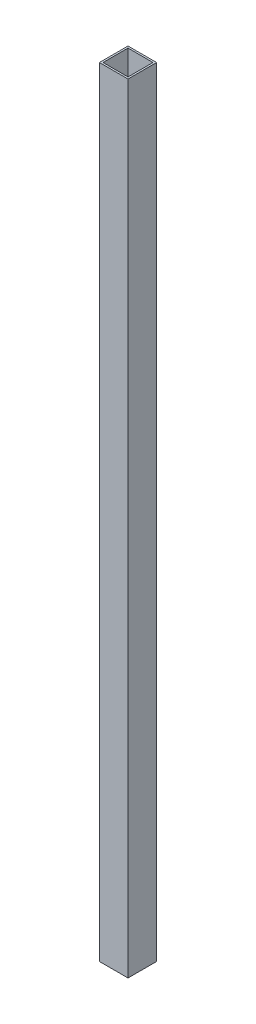
ISO-10303-21;
HEADER;
FILE_DESCRIPTION(('STEP AP214'),'2;1');
FILE_NAME('part.step','',(''),(''),'','','');
FILE_SCHEMA(('AUTOMOTIVE_DESIGN { 1 0 10303 214 1 1 1 1 }'));
ENDSEC;
DATA;
#1=APPLICATION_CONTEXT('core data for automotive mechanical design processes');
#2=APPLICATION_PROTOCOL_DEFINITION('international standard','automotive_design',2000,#1);
#3=PRODUCT_CONTEXT('',#1,'mechanical');
#4=PRODUCT('Part','Part','',(#3));
#5=PRODUCT_RELATED_PRODUCT_CATEGORY('part','',(#4));
#6=PRODUCT_DEFINITION_FORMATION('','',#4);
#7=PRODUCT_DEFINITION_CONTEXT('part definition',#1,'design');
#8=PRODUCT_DEFINITION('design','',#6,#7);
#9=PRODUCT_DEFINITION_SHAPE('','',#8);
#10=(LENGTH_UNIT() NAMED_UNIT(*) SI_UNIT(.MILLI.,.METRE.));
#11=(NAMED_UNIT(*) PLANE_ANGLE_UNIT() SI_UNIT($,.RADIAN.));
#12=(NAMED_UNIT(*) SI_UNIT($,.STERADIAN.) SOLID_ANGLE_UNIT());
#13=UNCERTAINTY_MEASURE_WITH_UNIT(LENGTH_MEASURE(1.E-05),#10,'distance_accuracy_value','');
#14=(GEOMETRIC_REPRESENTATION_CONTEXT(3) GLOBAL_UNCERTAINTY_ASSIGNED_CONTEXT((#13)) GLOBAL_UNIT_ASSIGNED_CONTEXT((#10,
#11,#12)) REPRESENTATION_CONTEXT('',''));
#15=CARTESIAN_POINT('',(0.,0.,0.));
#16=DIRECTION('',(0.,0.,1.));
#17=DIRECTION('',(1.,0.,0.));
#18=AXIS2_PLACEMENT_3D('',#15,#16,#17);
#19=CARTESIAN_POINT('',(88.9,0.,25.4));
#20=DIRECTION('',(-1.,0.,0.));
#21=DIRECTION('',(0.,0.,1.));
#22=AXIS2_PLACEMENT_3D('',#19,#20,#21);
#23=PLANE('',#22);
#24=DIRECTION('',(0.,1.,0.));
#25=VECTOR('',#24,1.);
#26=CARTESIAN_POINT('',(88.9,0.,0.));
#27=LINE('',#26,#25);
#28=CARTESIAN_POINT('',(88.9,93.726,0.));
#29=VERTEX_POINT('',#28);
#30=CARTESIAN_POINT('',(88.9,785.951879654335,0.));
#31=VERTEX_POINT('',#30);
#32=EDGE_CURVE('E138',#29,#31,#27,.T.);
#33=ORIENTED_EDGE('',*,*,#32,.F.);
#34=DIRECTION('',(0.,0.,-1.));
#35=VECTOR('',#34,1.);
#36=CARTESIAN_POINT('',(88.9,93.726,25.4));
#37=LINE('',#36,#35);
#38=CARTESIAN_POINT('',(88.9,93.726,25.4));
#39=VERTEX_POINT('',#38);
#40=EDGE_CURVE('E11',#39,#29,#37,.T.);
#41=ORIENTED_EDGE('',*,*,#40,.F.);
#42=DIRECTION('',(0.,1.,0.));
#43=VECTOR('',#42,1.);
#44=CARTESIAN_POINT('',(88.9,0.,25.4));
#45=LINE('',#44,#43);
#46=CARTESIAN_POINT('',(88.9,785.951879654335,25.4));
#47=VERTEX_POINT('',#46);
#48=EDGE_CURVE('E142',#39,#47,#45,.T.);
#49=ORIENTED_EDGE('',*,*,#48,.T.);
#50=DIRECTION('',(0.,0.,-1.));
#51=VECTOR('',#50,1.);
#52=CARTESIAN_POINT('',(88.9,785.951879654335,25.4));
#53=LINE('',#52,#51);
#54=EDGE_CURVE('E152',#47,#31,#53,.T.);
#55=ORIENTED_EDGE('',*,*,#54,.T.);
#56=EDGE_LOOP('',(#33,#41,#49,#55));
#57=FACE_BOUND('',#56,.T.);
#58=ADVANCED_FACE('F42',(#57),#23,.T.);
#59=CARTESIAN_POINT('',(0.,93.726,25.4));
#60=DIRECTION('',(0.,1.,0.));
#61=DIRECTION('',(0.,0.,1.));
#62=AXIS2_PLACEMENT_3D('',#59,#60,#61);
#63=PLANE('',#62);
#64=DIRECTION('',(1.,0.,0.));
#65=VECTOR('',#64,1.);
#66=CARTESIAN_POINT('',(90.4875,93.726,1.5875));
#67=LINE('',#66,#65);
#68=CARTESIAN_POINT('',(90.4875,93.726,1.5875));
#69=VERTEX_POINT('',#68);
#70=CARTESIAN_POINT('',(112.7125,93.726,1.5875));
#71=VERTEX_POINT('',#70);
#72=EDGE_CURVE('E132',#69,#71,#67,.T.);
#73=ORIENTED_EDGE('',*,*,#72,.F.);
#74=DIRECTION('',(0.,0.,-1.));
#75=VECTOR('',#74,1.);
#76=CARTESIAN_POINT('',(90.4875,93.726,23.8125));
#77=LINE('',#76,#75);
#78=CARTESIAN_POINT('',(90.4875,93.726,23.8125));
#79=VERTEX_POINT('',#78);
#80=EDGE_CURVE('E56',#79,#69,#77,.T.);
#81=ORIENTED_EDGE('',*,*,#80,.F.);
#82=DIRECTION('',(-1.,0.,0.));
#83=VECTOR('',#82,1.);
#84=CARTESIAN_POINT('',(90.4875,93.726,23.8125));
#85=LINE('',#84,#83);
#86=CARTESIAN_POINT('',(112.7125,93.726,23.8125));
#87=VERTEX_POINT('',#86);
#88=EDGE_CURVE('E123',#87,#79,#85,.T.);
#89=ORIENTED_EDGE('',*,*,#88,.F.);
#90=DIRECTION('',(0.,0.,1.));
#91=VECTOR('',#90,1.);
#92=CARTESIAN_POINT('',(112.7125,93.726,23.8125));
#93=LINE('',#92,#91);
#94=EDGE_CURVE('E126',#71,#87,#93,.T.);
#95=ORIENTED_EDGE('',*,*,#94,.F.);
#96=EDGE_LOOP('',(#73,#81,#89,#95));
#97=FACE_BOUND('',#96,.T.);
#98=DIRECTION('',(1.,0.,0.));
#99=VECTOR('',#98,1.);
#100=CARTESIAN_POINT('',(0.,93.726,0.));
#101=LINE('',#100,#99);
#102=CARTESIAN_POINT('',(114.3,93.726,0.));
#103=VERTEX_POINT('',#102);
#104=EDGE_CURVE('E155',#29,#103,#101,.T.);
#105=ORIENTED_EDGE('',*,*,#104,.T.);
#106=DIRECTION('',(0.,0.,-1.));
#107=VECTOR('',#106,1.);
#108=CARTESIAN_POINT('',(114.3,93.726,25.4));
#109=LINE('',#108,#107);
#110=CARTESIAN_POINT('',(114.3,93.726,25.4));
#111=VERTEX_POINT('',#110);
#112=EDGE_CURVE('E49',#111,#103,#109,.T.);
#113=ORIENTED_EDGE('',*,*,#112,.F.);
#114=DIRECTION('',(1.,0.,0.));
#115=VECTOR('',#114,1.);
#116=CARTESIAN_POINT('',(0.,93.726,25.4));
#117=LINE('',#116,#115);
#118=EDGE_CURVE('E145',#39,#111,#117,.T.);
#119=ORIENTED_EDGE('',*,*,#118,.F.);
#120=ORIENTED_EDGE('',*,*,#40,.T.);
#121=EDGE_LOOP('',(#105,#113,#119,#120));
#122=FACE_BOUND('',#121,.T.);
#123=ADVANCED_FACE('F183',(#97,#122),#63,.F.);
#124=CARTESIAN_POINT('',(114.3,0.,25.4));
#125=DIRECTION('',(-1.,0.,0.));
#126=DIRECTION('',(0.,-1.,0.));
#127=AXIS2_PLACEMENT_3D('',#124,#125,#126);
#128=PLANE('',#127);
#129=DIRECTION('',(0.,1.,0.));
#130=VECTOR('',#129,1.);
#131=CARTESIAN_POINT('',(114.3,0.,0.));
#132=LINE('',#131,#130);
#133=CARTESIAN_POINT('',(114.3,785.951879654336,0.));
#134=VERTEX_POINT('',#133);
#135=EDGE_CURVE('E157',#103,#134,#132,.T.);
#136=ORIENTED_EDGE('',*,*,#135,.T.);
#137=DIRECTION('',(0.,0.,-1.));
#138=VECTOR('',#137,1.);
#139=CARTESIAN_POINT('',(114.3,785.951879654336,25.4));
#140=LINE('',#139,#138);
#141=CARTESIAN_POINT('',(114.3,785.951879654336,25.4));
#142=VERTEX_POINT('',#141);
#143=EDGE_CURVE('E162',#142,#134,#140,.T.);
#144=ORIENTED_EDGE('',*,*,#143,.F.);
#145=DIRECTION('',(0.,1.,0.));
#146=VECTOR('',#145,1.);
#147=CARTESIAN_POINT('',(114.3,0.,25.4));
#148=LINE('',#147,#146);
#149=EDGE_CURVE('E148',#111,#142,#148,.T.);
#150=ORIENTED_EDGE('',*,*,#149,.F.);
#151=ORIENTED_EDGE('',*,*,#112,.T.);
#152=EDGE_LOOP('',(#136,#144,#150,#151));
#153=FACE_BOUND('',#152,.T.);
#154=ADVANCED_FACE('F169',(#153),#128,.F.);
#155=CARTESIAN_POINT('',(-3.43536170488056E-12,785.951879654335,25.4));
#156=DIRECTION('',(0.,-1.,0.));
#157=DIRECTION('',(1.,0.,0.));
#158=AXIS2_PLACEMENT_3D('',#155,#156,#157);
#159=PLANE('',#158);
#160=DIRECTION('',(-1.,0.,0.));
#161=VECTOR('',#160,1.);
#162=CARTESIAN_POINT('',(90.4875,785.951879654336,23.8125));
#163=LINE('',#162,#161);
#164=CARTESIAN_POINT('',(112.7125,785.951879654336,23.8125));
#165=VERTEX_POINT('',#164);
#166=CARTESIAN_POINT('',(90.4875,785.951879654336,23.8125));
#167=VERTEX_POINT('',#166);
#168=EDGE_CURVE('E113',#165,#167,#163,.T.);
#169=ORIENTED_EDGE('',*,*,#168,.T.);
#170=DIRECTION('',(0.,0.,-1.));
#171=VECTOR('',#170,1.);
#172=CARTESIAN_POINT('',(90.4875,785.951879654336,23.8125));
#173=LINE('',#172,#171);
#174=CARTESIAN_POINT('',(90.4875,785.951879654336,1.5875));
#175=VERTEX_POINT('',#174);
#176=EDGE_CURVE('E107',#167,#175,#173,.T.);
#177=ORIENTED_EDGE('',*,*,#176,.T.);
#178=DIRECTION('',(1.,0.,0.));
#179=VECTOR('',#178,1.);
#180=CARTESIAN_POINT('',(90.4875,785.951879654336,1.5875));
#181=LINE('',#180,#179);
#182=CARTESIAN_POINT('',(112.7125,785.951879654335,1.5875));
#183=VERTEX_POINT('',#182);
#184=EDGE_CURVE('E116',#175,#183,#181,.T.);
#185=ORIENTED_EDGE('',*,*,#184,.T.);
#186=DIRECTION('',(0.,0.,1.));
#187=VECTOR('',#186,1.);
#188=CARTESIAN_POINT('',(112.7125,785.951879654336,23.8125));
#189=LINE('',#188,#187);
#190=EDGE_CURVE('E64',#183,#165,#189,.T.);
#191=ORIENTED_EDGE('',*,*,#190,.T.);
#192=EDGE_LOOP('',(#169,#177,#185,#191));
#193=FACE_BOUND('',#192,.T.);
#194=DIRECTION('',(-1.,0.,0.));
#195=VECTOR('',#194,1.);
#196=CARTESIAN_POINT('',(-3.43536170488056E-12,785.951879654335,0.));
#197=LINE('',#196,#195);
#198=EDGE_CURVE('E146',#134,#31,#197,.T.);
#199=ORIENTED_EDGE('',*,*,#198,.T.);
#200=ORIENTED_EDGE('',*,*,#54,.F.);
#201=DIRECTION('',(-1.,0.,0.));
#202=VECTOR('',#201,1.);
#203=CARTESIAN_POINT('',(-3.43536170488056E-12,785.951879654335,25.4));
#204=LINE('',#203,#202);
#205=EDGE_CURVE('E150',#142,#47,#204,.T.);
#206=ORIENTED_EDGE('',*,*,#205,.F.);
#207=ORIENTED_EDGE('',*,*,#143,.T.);
#208=EDGE_LOOP('',(#199,#200,#206,#207));
#209=FACE_BOUND('',#208,.T.);
#210=ADVANCED_FACE('F120',(#193,#209),#159,.F.);
#211=CARTESIAN_POINT('',(0.,0.,25.4));
#212=DIRECTION('',(0.,0.,1.));
#213=DIRECTION('',(1.,0.,0.));
#214=AXIS2_PLACEMENT_3D('',#211,#212,#213);
#215=PLANE('',#214);
#216=ORIENTED_EDGE('',*,*,#48,.F.);
#217=ORIENTED_EDGE('',*,*,#118,.T.);
#218=ORIENTED_EDGE('',*,*,#149,.T.);
#219=ORIENTED_EDGE('',*,*,#205,.T.);
#220=EDGE_LOOP('',(#216,#217,#218,#219));
#221=FACE_BOUND('',#220,.T.);
#222=ADVANCED_FACE('F182',(#221),#215,.T.);
#223=CARTESIAN_POINT('',(0.,0.,0.));
#224=DIRECTION('',(0.,0.,1.));
#225=DIRECTION('',(1.,0.,0.));
#226=AXIS2_PLACEMENT_3D('',#223,#224,#225);
#227=PLANE('',#226);
#228=ORIENTED_EDGE('',*,*,#32,.T.);
#229=ORIENTED_EDGE('',*,*,#198,.F.);
#230=ORIENTED_EDGE('',*,*,#135,.F.);
#231=ORIENTED_EDGE('',*,*,#104,.F.);
#232=EDGE_LOOP('',(#228,#229,#230,#231));
#233=FACE_BOUND('',#232,.T.);
#234=ADVANCED_FACE('F176',(#233),#227,.F.);
#235=CARTESIAN_POINT('',(90.4875,785.951879654336,23.8125));
#236=DIRECTION('',(-1.,0.,0.));
#237=DIRECTION('',(0.,0.,1.));
#238=AXIS2_PLACEMENT_3D('',#235,#236,#237);
#239=PLANE('',#238);
#240=ORIENTED_EDGE('',*,*,#80,.T.);
#241=DIRECTION('',(0.,-1.,0.));
#242=VECTOR('',#241,1.);
#243=CARTESIAN_POINT('',(90.4875,785.951879654336,1.5875));
#244=LINE('',#243,#242);
#245=EDGE_CURVE('E103',#175,#69,#244,.T.);
#246=ORIENTED_EDGE('',*,*,#245,.F.);
#247=ORIENTED_EDGE('',*,*,#176,.F.);
#248=DIRECTION('',(0.,-1.,0.));
#249=VECTOR('',#248,1.);
#250=CARTESIAN_POINT('',(90.4875,785.951879654336,23.8125));
#251=LINE('',#250,#249);
#252=EDGE_CURVE('E136',#167,#79,#251,.T.);
#253=ORIENTED_EDGE('',*,*,#252,.T.);
#254=EDGE_LOOP('',(#240,#246,#247,#253));
#255=FACE_BOUND('',#254,.T.);
#256=ADVANCED_FACE('F105',(#255),#239,.F.);
#257=CARTESIAN_POINT('',(90.4875,785.951879654336,23.8125));
#258=DIRECTION('',(0.,0.,1.));
#259=DIRECTION('',(1.,0.,0.));
#260=AXIS2_PLACEMENT_3D('',#257,#258,#259);
#261=PLANE('',#260);
#262=ORIENTED_EDGE('',*,*,#88,.T.);
#263=ORIENTED_EDGE('',*,*,#252,.F.);
#264=ORIENTED_EDGE('',*,*,#168,.F.);
#265=DIRECTION('',(0.,-1.,0.));
#266=VECTOR('',#265,1.);
#267=CARTESIAN_POINT('',(112.7125,785.951879654336,23.8125));
#268=LINE('',#267,#266);
#269=EDGE_CURVE('E139',#165,#87,#268,.T.);
#270=ORIENTED_EDGE('',*,*,#269,.T.);
#271=EDGE_LOOP('',(#262,#263,#264,#270));
#272=FACE_BOUND('',#271,.T.);
#273=ADVANCED_FACE('F203',(#272),#261,.F.);
#274=CARTESIAN_POINT('',(112.7125,785.951879654336,23.8125));
#275=DIRECTION('',(1.,0.,0.));
#276=DIRECTION('',(0.,0.,-1.));
#277=AXIS2_PLACEMENT_3D('',#274,#275,#276);
#278=PLANE('',#277);
#279=ORIENTED_EDGE('',*,*,#94,.T.);
#280=ORIENTED_EDGE('',*,*,#269,.F.);
#281=ORIENTED_EDGE('',*,*,#190,.F.);
#282=DIRECTION('',(0.,-1.,0.));
#283=VECTOR('',#282,1.);
#284=CARTESIAN_POINT('',(112.7125,785.951879654336,1.5875));
#285=LINE('',#284,#283);
#286=EDGE_CURVE('E112',#183,#71,#285,.T.);
#287=ORIENTED_EDGE('',*,*,#286,.T.);
#288=EDGE_LOOP('',(#279,#280,#281,#287));
#289=FACE_BOUND('',#288,.T.);
#290=ADVANCED_FACE('F206',(#289),#278,.F.);
#291=CARTESIAN_POINT('',(90.4875,785.951879654336,1.5875));
#292=DIRECTION('',(0.,0.,-1.));
#293=DIRECTION('',(-1.,0.,0.));
#294=AXIS2_PLACEMENT_3D('',#291,#292,#293);
#295=PLANE('',#294);
#296=ORIENTED_EDGE('',*,*,#72,.T.);
#297=ORIENTED_EDGE('',*,*,#286,.F.);
#298=ORIENTED_EDGE('',*,*,#184,.F.);
#299=ORIENTED_EDGE('',*,*,#245,.T.);
#300=EDGE_LOOP('',(#296,#297,#298,#299));
#301=FACE_BOUND('',#300,.T.);
#302=ADVANCED_FACE('F117',(#301),#295,.F.);
#303=CLOSED_SHELL('',(#58,#123,#154,#210,#222,#234,#256,#273,#290,#302));
#304=MANIFOLD_SOLID_BREP('B2',#303);
#305=ADVANCED_BREP_SHAPE_REPRESENTATION('',(#18,#304),#14);
#306=SHAPE_DEFINITION_REPRESENTATION(#9,#305);
ENDSEC;
END-ISO-10303-21;
